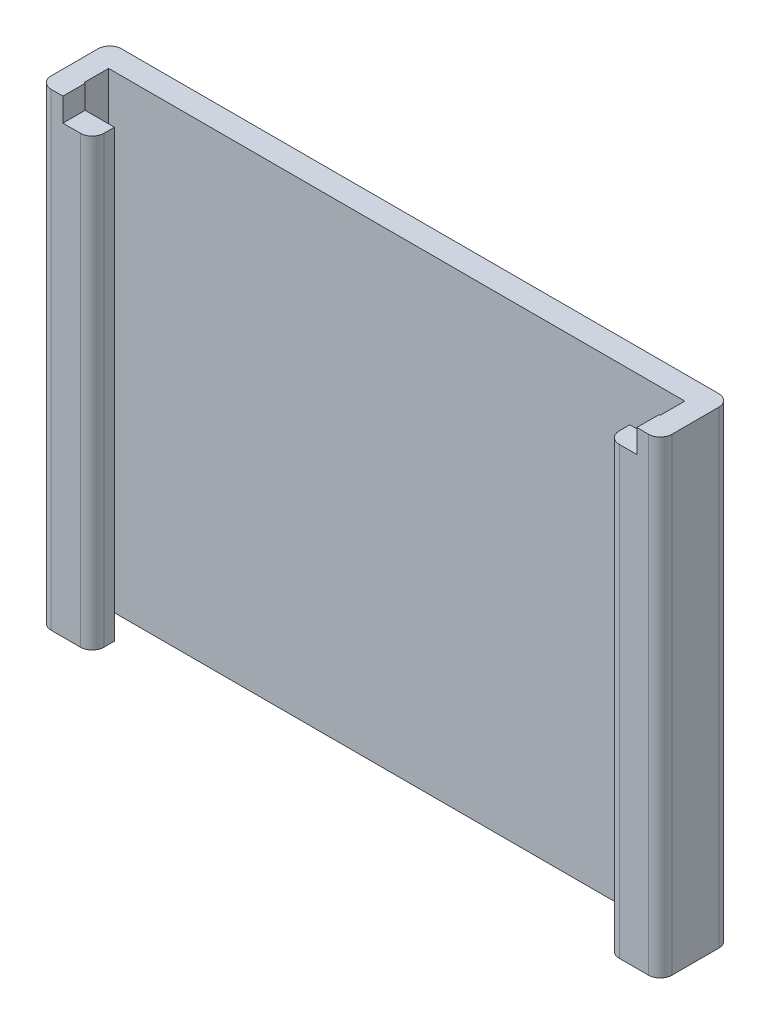
ISO-10303-21;
HEADER;
FILE_DESCRIPTION(('STEP AP214'),'2;1');
FILE_NAME('part.step','',(''),(''),'','','');
FILE_SCHEMA(('AUTOMOTIVE_DESIGN { 1 0 10303 214 1 1 1 1 }'));
ENDSEC;
DATA;
#1=APPLICATION_CONTEXT('core data for automotive mechanical design processes');
#2=APPLICATION_PROTOCOL_DEFINITION('international standard','automotive_design',2000,#1);
#3=PRODUCT_CONTEXT('',#1,'mechanical');
#4=PRODUCT('Part','Part','',(#3));
#5=PRODUCT_RELATED_PRODUCT_CATEGORY('part','',(#4));
#6=PRODUCT_DEFINITION_FORMATION('','',#4);
#7=PRODUCT_DEFINITION_CONTEXT('part definition',#1,'design');
#8=PRODUCT_DEFINITION('design','',#6,#7);
#9=PRODUCT_DEFINITION_SHAPE('','',#8);
#10=(LENGTH_UNIT() NAMED_UNIT(*) SI_UNIT(.MILLI.,.METRE.));
#11=(NAMED_UNIT(*) PLANE_ANGLE_UNIT() SI_UNIT($,.RADIAN.));
#12=(NAMED_UNIT(*) SI_UNIT($,.STERADIAN.) SOLID_ANGLE_UNIT());
#13=UNCERTAINTY_MEASURE_WITH_UNIT(LENGTH_MEASURE(1.E-05),#10,'distance_accuracy_value','');
#14=(GEOMETRIC_REPRESENTATION_CONTEXT(3) GLOBAL_UNCERTAINTY_ASSIGNED_CONTEXT((#13)) GLOBAL_UNIT_ASSIGNED_CONTEXT((#10,
#11,#12)) REPRESENTATION_CONTEXT('',''));
#15=CARTESIAN_POINT('',(0.,0.,0.));
#16=DIRECTION('',(0.,0.,1.));
#17=DIRECTION('',(1.,0.,0.));
#18=AXIS2_PLACEMENT_3D('',#15,#16,#17);
#19=CARTESIAN_POINT('',(-22.,40.,4.));
#20=DIRECTION('',(-1.,0.,0.));
#21=DIRECTION('',(0.,0.,1.));
#22=AXIS2_PLACEMENT_3D('',#19,#20,#21);
#23=PLANE('',#22);
#24=DIRECTION('',(0.,-1.,0.));
#25=VECTOR('',#24,1.);
#26=CARTESIAN_POINT('',(-22.,45.,2.1));
#27=LINE('',#26,#25);
#28=CARTESIAN_POINT('',(-22.,38.,2.1));
#29=VERTEX_POINT('',#28);
#30=CARTESIAN_POINT('',(-22.,0.,2.1));
#31=VERTEX_POINT('',#30);
#32=EDGE_CURVE('E264',#29,#31,#27,.T.);
#33=ORIENTED_EDGE('',*,*,#32,.F.);
#34=DIRECTION('',(0.,0.,-1.));
#35=VECTOR('',#34,1.);
#36=CARTESIAN_POINT('',(-22.,38.,4.));
#37=LINE('',#36,#35);
#38=CARTESIAN_POINT('',(-22.,38.,3.));
#39=VERTEX_POINT('',#38);
#40=EDGE_CURVE('E276',#39,#29,#37,.T.);
#41=ORIENTED_EDGE('',*,*,#40,.F.);
#42=DIRECTION('',(0.,-1.,0.));
#43=VECTOR('',#42,1.);
#44=CARTESIAN_POINT('',(-22.,40.,3.));
#45=LINE('',#44,#43);
#46=CARTESIAN_POINT('',(-22.,0.,3.));
#47=VERTEX_POINT('',#46);
#48=EDGE_CURVE('E393',#39,#47,#45,.T.);
#49=ORIENTED_EDGE('',*,*,#48,.T.);
#50=DIRECTION('',(0.,0.,-1.));
#51=VECTOR('',#50,1.);
#52=CARTESIAN_POINT('',(-22.,0.,4.));
#53=LINE('',#52,#51);
#54=EDGE_CURVE('E207',#47,#31,#53,.T.);
#55=ORIENTED_EDGE('',*,*,#54,.T.);
#56=EDGE_LOOP('',(#33,#41,#49,#55));
#57=FACE_BOUND('',#56,.T.);
#58=ADVANCED_FACE('F45',(#57),#23,.F.);
#59=CARTESIAN_POINT('',(0.,40.,0.));
#60=DIRECTION('',(0.,1.,0.));
#61=DIRECTION('',(0.,0.,1.));
#62=AXIS2_PLACEMENT_3D('',#59,#60,#61);
#63=PLANE('',#62);
#64=DIRECTION('',(1.,0.,0.));
#65=VECTOR('',#64,1.);
#66=CARTESIAN_POINT('',(-24.5,40.,2.1));
#67=LINE('',#66,#65);
#68=CARTESIAN_POINT('',(-24.6,40.,2.1));
#69=VERTEX_POINT('',#68);
#70=CARTESIAN_POINT('',(-24.5,40.,2.1));
#71=VERTEX_POINT('',#70);
#72=EDGE_CURVE('E223',#69,#71,#67,.T.);
#73=ORIENTED_EDGE('',*,*,#72,.F.);
#74=DIRECTION('',(0.,0.,1.));
#75=VECTOR('',#74,1.);
#76=CARTESIAN_POINT('',(-24.6,40.,0.));
#77=LINE('',#76,#75);
#78=CARTESIAN_POINT('',(-24.6,40.,0.));
#79=VERTEX_POINT('',#78);
#80=EDGE_CURVE('E226',#79,#69,#77,.T.);
#81=ORIENTED_EDGE('',*,*,#80,.F.);
#82=DIRECTION('',(-1.,0.,0.));
#83=VECTOR('',#82,1.);
#84=CARTESIAN_POINT('',(24.5,40.,0.));
#85=LINE('',#84,#83);
#86=CARTESIAN_POINT('',(24.6,40.,0.));
#87=VERTEX_POINT('',#86);
#88=EDGE_CURVE('E213',#87,#79,#85,.T.);
#89=ORIENTED_EDGE('',*,*,#88,.F.);
#90=DIRECTION('',(0.,0.,-1.));
#91=VECTOR('',#90,1.);
#92=CARTESIAN_POINT('',(24.6,40.,0.));
#93=LINE('',#92,#91);
#94=CARTESIAN_POINT('',(24.6,40.,2.1));
#95=VERTEX_POINT('',#94);
#96=EDGE_CURVE('E248',#95,#87,#93,.T.);
#97=ORIENTED_EDGE('',*,*,#96,.F.);
#98=DIRECTION('',(1.,0.,0.));
#99=VECTOR('',#98,1.);
#100=CARTESIAN_POINT('',(24.5,40.,2.1));
#101=LINE('',#100,#99);
#102=CARTESIAN_POINT('',(24.5,40.,2.1));
#103=VERTEX_POINT('',#102);
#104=EDGE_CURVE('E230',#103,#95,#101,.T.);
#105=ORIENTED_EDGE('',*,*,#104,.F.);
#106=DIRECTION('',(0.,0.,1.));
#107=VECTOR('',#106,1.);
#108=CARTESIAN_POINT('',(24.5,40.,0.));
#109=LINE('',#108,#107);
#110=CARTESIAN_POINT('',(24.5,40.,4.));
#111=VERTEX_POINT('',#110);
#112=EDGE_CURVE('E324',#103,#111,#109,.T.);
#113=ORIENTED_EDGE('',*,*,#112,.T.);
#114=DIRECTION('',(-1.,0.,0.));
#115=VECTOR('',#114,1.);
#116=CARTESIAN_POINT('',(26.5,40.,3.99999999999997));
#117=LINE('',#116,#115);
#118=CARTESIAN_POINT('',(25.5,40.,3.99999999999997));
#119=VERTEX_POINT('',#118);
#120=EDGE_CURVE('E320',#119,#111,#117,.T.);
#121=ORIENTED_EDGE('',*,*,#120,.F.);
#122=CARTESIAN_POINT('',(25.5,40.,2.99999999999997));
#123=DIRECTION('',(0.,1.,0.));
#124=DIRECTION('',(0.,0.,1.));
#125=AXIS2_PLACEMENT_3D('',#122,#123,#124);
#126=CIRCLE('',#125,1.);
#127=CARTESIAN_POINT('',(26.5,40.,2.99999999999997));
#128=VERTEX_POINT('',#127);
#129=EDGE_CURVE('E387',#119,#128,#126,.T.);
#130=ORIENTED_EDGE('',*,*,#129,.T.);
#131=DIRECTION('',(0.,0.,1.));
#132=VECTOR('',#131,1.);
#133=CARTESIAN_POINT('',(26.5,40.,-2.00000000000003));
#134=LINE('',#133,#132);
#135=CARTESIAN_POINT('',(26.5,40.,-1.00000000000003));
#136=VERTEX_POINT('',#135);
#137=EDGE_CURVE('E316',#136,#128,#134,.T.);
#138=ORIENTED_EDGE('',*,*,#137,.F.);
#139=CARTESIAN_POINT('',(25.5,40.,-1.00000000000003));
#140=DIRECTION('',(0.,1.,0.));
#141=DIRECTION('',(0.,0.,1.));
#142=AXIS2_PLACEMENT_3D('',#139,#140,#141);
#143=CIRCLE('',#142,1.);
#144=CARTESIAN_POINT('',(25.5,40.,-2.00000000000003));
#145=VERTEX_POINT('',#144);
#146=EDGE_CURVE('E390',#136,#145,#143,.T.);
#147=ORIENTED_EDGE('',*,*,#146,.T.);
#148=DIRECTION('',(-1.,0.,0.));
#149=VECTOR('',#148,1.);
#150=CARTESIAN_POINT('',(26.5,40.,-2.00000000000003));
#151=LINE('',#150,#149);
#152=CARTESIAN_POINT('',(-25.5,40.,-2.));
#153=VERTEX_POINT('',#152);
#154=EDGE_CURVE('E312',#145,#153,#151,.T.);
#155=ORIENTED_EDGE('',*,*,#154,.T.);
#156=CARTESIAN_POINT('',(-25.5,40.,-0.999999999999997));
#157=DIRECTION('',(0.,1.,0.));
#158=DIRECTION('',(0.,0.,1.));
#159=AXIS2_PLACEMENT_3D('',#156,#157,#158);
#160=CIRCLE('',#159,1.);
#161=CARTESIAN_POINT('',(-26.5,40.,-0.999999999999997));
#162=VERTEX_POINT('',#161);
#163=EDGE_CURVE('E384',#153,#162,#160,.T.);
#164=ORIENTED_EDGE('',*,*,#163,.T.);
#165=DIRECTION('',(0.,0.,1.));
#166=VECTOR('',#165,1.);
#167=CARTESIAN_POINT('',(-26.5,40.,-2.));
#168=LINE('',#167,#166);
#169=CARTESIAN_POINT('',(-26.5,40.,3.));
#170=VERTEX_POINT('',#169);
#171=EDGE_CURVE('E308',#162,#170,#168,.T.);
#172=ORIENTED_EDGE('',*,*,#171,.T.);
#173=CARTESIAN_POINT('',(-25.5,40.,3.));
#174=DIRECTION('',(0.,1.,0.));
#175=DIRECTION('',(0.,0.,1.));
#176=AXIS2_PLACEMENT_3D('',#173,#174,#175);
#177=CIRCLE('',#176,1.);
#178=CARTESIAN_POINT('',(-25.5,40.,4.));
#179=VERTEX_POINT('',#178);
#180=EDGE_CURVE('E381',#170,#179,#177,.T.);
#181=ORIENTED_EDGE('',*,*,#180,.T.);
#182=DIRECTION('',(1.,0.,0.));
#183=VECTOR('',#182,1.);
#184=CARTESIAN_POINT('',(-26.5,40.,4.));
#185=LINE('',#184,#183);
#186=CARTESIAN_POINT('',(-24.5,40.,4.));
#187=VERTEX_POINT('',#186);
#188=EDGE_CURVE('E304',#179,#187,#185,.T.);
#189=ORIENTED_EDGE('',*,*,#188,.T.);
#190=DIRECTION('',(0.,0.,1.));
#191=VECTOR('',#190,1.);
#192=CARTESIAN_POINT('',(-24.5,40.,0.));
#193=LINE('',#192,#191);
#194=EDGE_CURVE('E300',#71,#187,#193,.T.);
#195=ORIENTED_EDGE('',*,*,#194,.F.);
#196=EDGE_LOOP('',(#73,#81,#89,#97,#105,#113,#121,#130,#138,#147,#155,#164,#172,#181,#189,#195));
#197=FACE_BOUND('',#196,.T.);
#198=ADVANCED_FACE('F451',(#197),#63,.T.);
#199=CARTESIAN_POINT('',(0.,0.,0.));
#200=DIRECTION('',(0.,1.,0.));
#201=DIRECTION('',(0.,0.,1.));
#202=AXIS2_PLACEMENT_3D('',#199,#200,#201);
#203=PLANE('',#202);
#204=DIRECTION('',(0.,0.,1.));
#205=VECTOR('',#204,1.);
#206=CARTESIAN_POINT('',(-24.6,0.,0.));
#207=LINE('',#206,#205);
#208=CARTESIAN_POINT('',(-24.6,0.,0.));
#209=VERTEX_POINT('',#208);
#210=CARTESIAN_POINT('',(-24.6,0.,2.1));
#211=VERTEX_POINT('',#210);
#212=EDGE_CURVE('E200',#209,#211,#207,.T.);
#213=ORIENTED_EDGE('',*,*,#212,.T.);
#214=DIRECTION('',(1.,0.,0.));
#215=VECTOR('',#214,1.);
#216=CARTESIAN_POINT('',(-24.5,0.,2.1));
#217=LINE('',#216,#215);
#218=EDGE_CURVE('E261',#211,#31,#217,.T.);
#219=ORIENTED_EDGE('',*,*,#218,.T.);
#220=ORIENTED_EDGE('',*,*,#54,.F.);
#221=CARTESIAN_POINT('',(-23.,0.,3.));
#222=DIRECTION('',(0.,1.,0.));
#223=DIRECTION('',(0.,0.,1.));
#224=AXIS2_PLACEMENT_3D('',#221,#222,#223);
#225=CIRCLE('',#224,1.);
#226=CARTESIAN_POINT('',(-23.,0.,4.));
#227=VERTEX_POINT('',#226);
#228=EDGE_CURVE('E371',#47,#227,#225,.F.);
#229=ORIENTED_EDGE('',*,*,#228,.T.);
#230=DIRECTION('',(1.,0.,0.));
#231=VECTOR('',#230,1.);
#232=CARTESIAN_POINT('',(-26.5,0.,4.));
#233=LINE('',#232,#231);
#234=CARTESIAN_POINT('',(-25.5,0.,4.));
#235=VERTEX_POINT('',#234);
#236=EDGE_CURVE('E331',#235,#227,#233,.T.);
#237=ORIENTED_EDGE('',*,*,#236,.F.);
#238=CARTESIAN_POINT('',(-25.5,0.,3.));
#239=DIRECTION('',(0.,1.,0.));
#240=DIRECTION('',(0.,0.,1.));
#241=AXIS2_PLACEMENT_3D('',#238,#239,#240);
#242=CIRCLE('',#241,1.);
#243=CARTESIAN_POINT('',(-26.5,0.,3.));
#244=VERTEX_POINT('',#243);
#245=EDGE_CURVE('E359',#235,#244,#242,.F.);
#246=ORIENTED_EDGE('',*,*,#245,.T.);
#247=DIRECTION('',(0.,0.,1.));
#248=VECTOR('',#247,1.);
#249=CARTESIAN_POINT('',(-26.5,0.,-2.));
#250=LINE('',#249,#248);
#251=CARTESIAN_POINT('',(-26.5,0.,-0.999999999999997));
#252=VERTEX_POINT('',#251);
#253=EDGE_CURVE('E335',#252,#244,#250,.T.);
#254=ORIENTED_EDGE('',*,*,#253,.F.);
#255=CARTESIAN_POINT('',(-25.5,0.,-0.999999999999997));
#256=DIRECTION('',(0.,1.,0.));
#257=DIRECTION('',(0.,0.,1.));
#258=AXIS2_PLACEMENT_3D('',#255,#256,#257);
#259=CIRCLE('',#258,1.);
#260=CARTESIAN_POINT('',(-25.5,0.,-2.));
#261=VERTEX_POINT('',#260);
#262=EDGE_CURVE('E362',#252,#261,#259,.F.);
#263=ORIENTED_EDGE('',*,*,#262,.T.);
#264=DIRECTION('',(-1.,0.,0.));
#265=VECTOR('',#264,1.);
#266=CARTESIAN_POINT('',(26.5,0.,-2.00000000000003));
#267=LINE('',#266,#265);
#268=CARTESIAN_POINT('',(25.5,0.,-2.00000000000003));
#269=VERTEX_POINT('',#268);
#270=EDGE_CURVE('E339',#269,#261,#267,.T.);
#271=ORIENTED_EDGE('',*,*,#270,.F.);
#272=CARTESIAN_POINT('',(25.5,0.,-1.00000000000003));
#273=DIRECTION('',(0.,1.,0.));
#274=DIRECTION('',(0.,0.,1.));
#275=AXIS2_PLACEMENT_3D('',#272,#273,#274);
#276=CIRCLE('',#275,1.);
#277=CARTESIAN_POINT('',(26.5,0.,-1.00000000000003));
#278=VERTEX_POINT('',#277);
#279=EDGE_CURVE('E368',#269,#278,#276,.F.);
#280=ORIENTED_EDGE('',*,*,#279,.T.);
#281=DIRECTION('',(0.,0.,1.));
#282=VECTOR('',#281,1.);
#283=CARTESIAN_POINT('',(26.5,0.,-2.00000000000003));
#284=LINE('',#283,#282);
#285=CARTESIAN_POINT('',(26.5,0.,2.99999999999997));
#286=VERTEX_POINT('',#285);
#287=EDGE_CURVE('E343',#278,#286,#284,.T.);
#288=ORIENTED_EDGE('',*,*,#287,.T.);
#289=CARTESIAN_POINT('',(25.5,0.,2.99999999999997));
#290=DIRECTION('',(0.,1.,0.));
#291=DIRECTION('',(0.,0.,1.));
#292=AXIS2_PLACEMENT_3D('',#289,#290,#291);
#293=CIRCLE('',#292,1.);
#294=CARTESIAN_POINT('',(25.5,0.,3.99999999999997));
#295=VERTEX_POINT('',#294);
#296=EDGE_CURVE('E365',#286,#295,#293,.F.);
#297=ORIENTED_EDGE('',*,*,#296,.T.);
#298=DIRECTION('',(-1.,0.,0.));
#299=VECTOR('',#298,1.);
#300=CARTESIAN_POINT('',(26.5,0.,3.99999999999997));
#301=LINE('',#300,#299);
#302=CARTESIAN_POINT('',(23.,0.,3.99999999999998));
#303=VERTEX_POINT('',#302);
#304=EDGE_CURVE('E347',#295,#303,#301,.T.);
#305=ORIENTED_EDGE('',*,*,#304,.T.);
#306=CARTESIAN_POINT('',(23.,0.,2.99999999999997));
#307=DIRECTION('',(0.,1.,0.));
#308=DIRECTION('',(0.,0.,1.));
#309=AXIS2_PLACEMENT_3D('',#306,#307,#308);
#310=CIRCLE('',#309,1.);
#311=CARTESIAN_POINT('',(22.,0.,2.99999999999997));
#312=VERTEX_POINT('',#311);
#313=EDGE_CURVE('E374',#303,#312,#310,.F.);
#314=ORIENTED_EDGE('',*,*,#313,.T.);
#315=DIRECTION('',(0.,0.,-1.));
#316=VECTOR('',#315,1.);
#317=CARTESIAN_POINT('',(22.,0.,3.99999999999998));
#318=LINE('',#317,#316);
#319=CARTESIAN_POINT('',(22.,0.,2.1));
#320=VERTEX_POINT('',#319);
#321=EDGE_CURVE('E301',#312,#320,#318,.T.);
#322=ORIENTED_EDGE('',*,*,#321,.T.);
#323=DIRECTION('',(-1.,0.,0.));
#324=VECTOR('',#323,1.);
#325=CARTESIAN_POINT('',(24.5,0.,2.1));
#326=LINE('',#325,#324);
#327=CARTESIAN_POINT('',(24.6,0.,2.1));
#328=VERTEX_POINT('',#327);
#329=EDGE_CURVE('E236',#328,#320,#326,.T.);
#330=ORIENTED_EDGE('',*,*,#329,.F.);
#331=DIRECTION('',(0.,0.,-1.));
#332=VECTOR('',#331,1.);
#333=CARTESIAN_POINT('',(24.6,0.,0.));
#334=LINE('',#333,#332);
#335=CARTESIAN_POINT('',(24.6,0.,0.));
#336=VERTEX_POINT('',#335);
#337=EDGE_CURVE('E202',#328,#336,#334,.T.);
#338=ORIENTED_EDGE('',*,*,#337,.T.);
#339=DIRECTION('',(-1.,0.,0.));
#340=VECTOR('',#339,1.);
#341=CARTESIAN_POINT('',(24.5,0.,0.));
#342=LINE('',#341,#340);
#343=EDGE_CURVE('E195',#336,#209,#342,.T.);
#344=ORIENTED_EDGE('',*,*,#343,.T.);
#345=EDGE_LOOP('',(#213,#219,#220,#229,#237,#246,#254,#263,#271,#280,#288,#297,#305,#314,#322,
#330,#338,#344));
#346=FACE_BOUND('',#345,.T.);
#347=ADVANCED_FACE('F197',(#346),#203,.F.);
#348=CARTESIAN_POINT('',(-23.,40.,3.));
#349=DIRECTION('',(0.,-1.,0.));
#350=DIRECTION('',(0.,0.,-1.));
#351=AXIS2_PLACEMENT_3D('',#348,#349,#350);
#352=CYLINDRICAL_SURFACE('',#351,1.);
#353=ORIENTED_EDGE('',*,*,#48,.F.);
#354=CARTESIAN_POINT('',(-23.,38.,3.));
#355=DIRECTION('',(0.,1.,0.));
#356=DIRECTION('',(0.,0.,1.));
#357=AXIS2_PLACEMENT_3D('',#354,#355,#356);
#358=CIRCLE('',#357,1.);
#359=CARTESIAN_POINT('',(-23.,38.,4.));
#360=VERTEX_POINT('',#359);
#361=EDGE_CURVE('E425',#39,#360,#358,.F.);
#362=ORIENTED_EDGE('',*,*,#361,.T.);
#363=DIRECTION('',(0.,-1.,0.));
#364=VECTOR('',#363,1.);
#365=CARTESIAN_POINT('',(-23.,40.,4.));
#366=LINE('',#365,#364);
#367=EDGE_CURVE('E400',#227,#360,#366,.F.);
#368=ORIENTED_EDGE('',*,*,#367,.F.);
#369=ORIENTED_EDGE('',*,*,#228,.F.);
#370=EDGE_LOOP('',(#353,#362,#368,#369));
#371=FACE_BOUND('',#370,.T.);
#372=ADVANCED_FACE('F529',(#371),#352,.T.);
#373=CARTESIAN_POINT('',(24.5,40.,0.));
#374=DIRECTION('',(0.,0.,1.));
#375=DIRECTION('',(1.,0.,0.));
#376=AXIS2_PLACEMENT_3D('',#373,#374,#375);
#377=PLANE('',#376);
#378=ORIENTED_EDGE('',*,*,#88,.T.);
#379=DIRECTION('',(0.,1.,0.));
#380=VECTOR('',#379,1.);
#381=CARTESIAN_POINT('',(-24.6,0.,0.));
#382=LINE('',#381,#380);
#383=EDGE_CURVE('E211',#209,#79,#382,.T.);
#384=ORIENTED_EDGE('',*,*,#383,.F.);
#385=ORIENTED_EDGE('',*,*,#343,.F.);
#386=DIRECTION('',(0.,1.,0.));
#387=VECTOR('',#386,1.);
#388=CARTESIAN_POINT('',(24.6,0.,0.));
#389=LINE('',#388,#387);
#390=EDGE_CURVE('E245',#336,#87,#389,.T.);
#391=ORIENTED_EDGE('',*,*,#390,.T.);
#392=EDGE_LOOP('',(#378,#384,#385,#391));
#393=FACE_BOUND('',#392,.T.);
#394=ADVANCED_FACE('F212',(#393),#377,.T.);
#395=CARTESIAN_POINT('',(24.5,40.,0.));
#396=DIRECTION('',(1.,0.,0.));
#397=DIRECTION('',(0.,0.,-1.));
#398=AXIS2_PLACEMENT_3D('',#395,#396,#397);
#399=PLANE('',#398);
#400=ORIENTED_EDGE('',*,*,#112,.F.);
#401=DIRECTION('',(0.,1.,0.));
#402=VECTOR('',#401,1.);
#403=CARTESIAN_POINT('',(24.5,0.,2.1));
#404=LINE('',#403,#402);
#405=CARTESIAN_POINT('',(24.5,38.,2.1));
#406=VERTEX_POINT('',#405);
#407=EDGE_CURVE('E239',#406,#103,#404,.T.);
#408=ORIENTED_EDGE('',*,*,#407,.F.);
#409=DIRECTION('',(0.,0.,-1.));
#410=VECTOR('',#409,1.);
#411=CARTESIAN_POINT('',(24.5,38.,2.));
#412=LINE('',#411,#410);
#413=CARTESIAN_POINT('',(24.5,38.,3.99999999999997));
#414=VERTEX_POINT('',#413);
#415=EDGE_CURVE('E267',#414,#406,#412,.T.);
#416=ORIENTED_EDGE('',*,*,#415,.F.);
#417=DIRECTION('',(0.,1.,0.));
#418=VECTOR('',#417,1.);
#419=CARTESIAN_POINT('',(24.5,40.,3.99999999999997));
#420=LINE('',#419,#418);
#421=EDGE_CURVE('E291',#414,#111,#420,.T.);
#422=ORIENTED_EDGE('',*,*,#421,.T.);
#423=EDGE_LOOP('',(#400,#408,#416,#422));
#424=FACE_BOUND('',#423,.T.);
#425=ADVANCED_FACE('F504',(#424),#399,.F.);
#426=CARTESIAN_POINT('',(22.,40.,3.99999999999998));
#427=DIRECTION('',(-1.,0.,0.));
#428=DIRECTION('',(0.,0.,1.));
#429=AXIS2_PLACEMENT_3D('',#426,#427,#428);
#430=PLANE('',#429);
#431=DIRECTION('',(0.,-1.,0.));
#432=VECTOR('',#431,1.);
#433=CARTESIAN_POINT('',(22.,45.,2.1));
#434=LINE('',#433,#432);
#435=CARTESIAN_POINT('',(22.,38.,2.1));
#436=VERTEX_POINT('',#435);
#437=EDGE_CURVE('E61',#436,#320,#434,.T.);
#438=ORIENTED_EDGE('',*,*,#437,.T.);
#439=ORIENTED_EDGE('',*,*,#321,.F.);
#440=DIRECTION('',(0.,-1.,0.));
#441=VECTOR('',#440,1.);
#442=CARTESIAN_POINT('',(22.,40.,2.99999999999997));
#443=LINE('',#442,#441);
#444=CARTESIAN_POINT('',(22.,38.,2.99999999999997));
#445=VERTEX_POINT('',#444);
#446=EDGE_CURVE('E377',#312,#445,#443,.F.);
#447=ORIENTED_EDGE('',*,*,#446,.T.);
#448=DIRECTION('',(0.,0.,1.));
#449=VECTOR('',#448,1.);
#450=CARTESIAN_POINT('',(22.,38.,3.99999999999998));
#451=LINE('',#450,#449);
#452=EDGE_CURVE('E67',#436,#445,#451,.T.);
#453=ORIENTED_EDGE('',*,*,#452,.F.);
#454=EDGE_LOOP('',(#438,#439,#447,#453));
#455=FACE_BOUND('',#454,.T.);
#456=ADVANCED_FACE('F506',(#455),#430,.T.);
#457=CARTESIAN_POINT('',(26.5,40.,3.99999999999997));
#458=DIRECTION('',(0.,0.,1.));
#459=DIRECTION('',(1.,0.,0.));
#460=AXIS2_PLACEMENT_3D('',#457,#458,#459);
#461=PLANE('',#460);
#462=ORIENTED_EDGE('',*,*,#421,.F.);
#463=DIRECTION('',(1.,0.,0.));
#464=VECTOR('',#463,1.);
#465=CARTESIAN_POINT('',(26.5,38.,3.99999999999997));
#466=LINE('',#465,#464);
#467=CARTESIAN_POINT('',(23.,38.,3.99999999999997));
#468=VERTEX_POINT('',#467);
#469=EDGE_CURVE('E286',#468,#414,#466,.T.);
#470=ORIENTED_EDGE('',*,*,#469,.F.);
#471=DIRECTION('',(0.,-1.,0.));
#472=VECTOR('',#471,1.);
#473=CARTESIAN_POINT('',(23.,40.,3.99999999999998));
#474=LINE('',#473,#472);
#475=EDGE_CURVE('E356',#468,#303,#474,.T.);
#476=ORIENTED_EDGE('',*,*,#475,.T.);
#477=ORIENTED_EDGE('',*,*,#304,.F.);
#478=DIRECTION('',(0.,-1.,0.));
#479=VECTOR('',#478,1.);
#480=CARTESIAN_POINT('',(25.5,40.,3.99999999999997));
#481=LINE('',#480,#479);
#482=EDGE_CURVE('E326',#295,#119,#481,.F.);
#483=ORIENTED_EDGE('',*,*,#482,.T.);
#484=ORIENTED_EDGE('',*,*,#120,.T.);
#485=EDGE_LOOP('',(#462,#470,#476,#477,#483,#484));
#486=FACE_BOUND('',#485,.T.);
#487=ADVANCED_FACE('F437',(#486),#461,.T.);
#488=CARTESIAN_POINT('',(26.5,40.,-2.00000000000003));
#489=DIRECTION('',(1.,0.,0.));
#490=DIRECTION('',(0.,0.,-1.));
#491=AXIS2_PLACEMENT_3D('',#488,#489,#490);
#492=PLANE('',#491);
#493=ORIENTED_EDGE('',*,*,#287,.F.);
#494=DIRECTION('',(0.,-1.,0.));
#495=VECTOR('',#494,1.);
#496=CARTESIAN_POINT('',(26.5,40.,-1.00000000000003));
#497=LINE('',#496,#495);
#498=EDGE_CURVE('E415',#278,#136,#497,.F.);
#499=ORIENTED_EDGE('',*,*,#498,.T.);
#500=ORIENTED_EDGE('',*,*,#137,.T.);
#501=DIRECTION('',(0.,-1.,0.));
#502=VECTOR('',#501,1.);
#503=CARTESIAN_POINT('',(26.5,40.,2.99999999999997));
#504=LINE('',#503,#502);
#505=EDGE_CURVE('E411',#128,#286,#504,.T.);
#506=ORIENTED_EDGE('',*,*,#505,.T.);
#507=EDGE_LOOP('',(#493,#499,#500,#506));
#508=FACE_BOUND('',#507,.T.);
#509=ADVANCED_FACE('F455',(#508),#492,.T.);
#510=CARTESIAN_POINT('',(26.5,40.,-2.00000000000003));
#511=DIRECTION('',(0.,0.,1.));
#512=DIRECTION('',(1.,0.,0.));
#513=AXIS2_PLACEMENT_3D('',#510,#511,#512);
#514=PLANE('',#513);
#515=ORIENTED_EDGE('',*,*,#154,.F.);
#516=DIRECTION('',(0.,-1.,0.));
#517=VECTOR('',#516,1.);
#518=CARTESIAN_POINT('',(25.5,0.,-2.00000000000003));
#519=LINE('',#518,#517);
#520=EDGE_CURVE('E407',#145,#269,#519,.T.);
#521=ORIENTED_EDGE('',*,*,#520,.T.);
#522=ORIENTED_EDGE('',*,*,#270,.T.);
#523=DIRECTION('',(0.,-1.,0.));
#524=VECTOR('',#523,1.);
#525=CARTESIAN_POINT('',(-25.5,40.,-2.));
#526=LINE('',#525,#524);
#527=EDGE_CURVE('E404',#261,#153,#526,.F.);
#528=ORIENTED_EDGE('',*,*,#527,.T.);
#529=EDGE_LOOP('',(#515,#521,#522,#528));
#530=FACE_BOUND('',#529,.T.);
#531=ADVANCED_FACE('F463',(#530),#514,.F.);
#532=CARTESIAN_POINT('',(-26.5,40.,-2.));
#533=DIRECTION('',(1.,0.,0.));
#534=DIRECTION('',(0.,0.,-1.));
#535=AXIS2_PLACEMENT_3D('',#532,#533,#534);
#536=PLANE('',#535);
#537=ORIENTED_EDGE('',*,*,#171,.F.);
#538=DIRECTION('',(0.,-1.,0.));
#539=VECTOR('',#538,1.);
#540=CARTESIAN_POINT('',(-26.5,40.,-0.999999999999997));
#541=LINE('',#540,#539);
#542=EDGE_CURVE('E421',#162,#252,#541,.T.);
#543=ORIENTED_EDGE('',*,*,#542,.T.);
#544=ORIENTED_EDGE('',*,*,#253,.T.);
#545=DIRECTION('',(0.,-1.,0.));
#546=VECTOR('',#545,1.);
#547=CARTESIAN_POINT('',(-26.5,40.,3.));
#548=LINE('',#547,#546);
#549=EDGE_CURVE('E418',#244,#170,#548,.F.);
#550=ORIENTED_EDGE('',*,*,#549,.T.);
#551=EDGE_LOOP('',(#537,#543,#544,#550));
#552=FACE_BOUND('',#551,.T.);
#553=ADVANCED_FACE('F472',(#552),#536,.F.);
#554=CARTESIAN_POINT('',(-26.5,40.,4.));
#555=DIRECTION('',(0.,0.,-1.));
#556=DIRECTION('',(-1.,0.,0.));
#557=AXIS2_PLACEMENT_3D('',#554,#555,#556);
#558=PLANE('',#557);
#559=DIRECTION('',(1.,0.,0.));
#560=VECTOR('',#559,1.);
#561=CARTESIAN_POINT('',(-26.5,38.,4.));
#562=LINE('',#561,#560);
#563=CARTESIAN_POINT('',(-24.5,38.,4.));
#564=VERTEX_POINT('',#563);
#565=EDGE_CURVE('E283',#564,#360,#562,.T.);
#566=ORIENTED_EDGE('',*,*,#565,.F.);
#567=DIRECTION('',(0.,1.,0.));
#568=VECTOR('',#567,1.);
#569=CARTESIAN_POINT('',(-24.5,40.,4.));
#570=LINE('',#569,#568);
#571=EDGE_CURVE('E208',#564,#187,#570,.T.);
#572=ORIENTED_EDGE('',*,*,#571,.T.);
#573=ORIENTED_EDGE('',*,*,#188,.F.);
#574=DIRECTION('',(0.,-1.,0.));
#575=VECTOR('',#574,1.);
#576=CARTESIAN_POINT('',(-25.5,40.,4.));
#577=LINE('',#576,#575);
#578=EDGE_CURVE('E396',#179,#235,#577,.T.);
#579=ORIENTED_EDGE('',*,*,#578,.T.);
#580=ORIENTED_EDGE('',*,*,#236,.T.);
#581=ORIENTED_EDGE('',*,*,#367,.T.);
#582=EDGE_LOOP('',(#566,#572,#573,#579,#580,#581));
#583=FACE_BOUND('',#582,.T.);
#584=ADVANCED_FACE('F481',(#583),#558,.F.);
#585=CARTESIAN_POINT('',(-24.5,40.,0.));
#586=DIRECTION('',(1.,0.,0.));
#587=DIRECTION('',(0.,0.,-1.));
#588=AXIS2_PLACEMENT_3D('',#585,#586,#587);
#589=PLANE('',#588);
#590=DIRECTION('',(0.,1.,0.));
#591=VECTOR('',#590,1.);
#592=CARTESIAN_POINT('',(-24.5,0.,2.1));
#593=LINE('',#592,#591);
#594=CARTESIAN_POINT('',(-24.5,38.,2.1));
#595=VERTEX_POINT('',#594);
#596=EDGE_CURVE('E232',#595,#71,#593,.T.);
#597=ORIENTED_EDGE('',*,*,#596,.T.);
#598=ORIENTED_EDGE('',*,*,#194,.T.);
#599=ORIENTED_EDGE('',*,*,#571,.F.);
#600=DIRECTION('',(0.,0.,1.));
#601=VECTOR('',#600,1.);
#602=CARTESIAN_POINT('',(-24.5,38.,4.82490347023973));
#603=LINE('',#602,#601);
#604=EDGE_CURVE('E272',#595,#564,#603,.T.);
#605=ORIENTED_EDGE('',*,*,#604,.F.);
#606=EDGE_LOOP('',(#597,#598,#599,#605));
#607=FACE_BOUND('',#606,.T.);
#608=ADVANCED_FACE('F485',(#607),#589,.T.);
#609=CARTESIAN_POINT('',(23.,40.,2.99999999999997));
#610=DIRECTION('',(0.,-1.,0.));
#611=DIRECTION('',(0.,0.,-1.));
#612=AXIS2_PLACEMENT_3D('',#609,#610,#611);
#613=CYLINDRICAL_SURFACE('',#612,1.);
#614=CARTESIAN_POINT('',(23.,38.,2.99999999999997));
#615=DIRECTION('',(0.,-1.,0.));
#616=DIRECTION('',(0.,0.,-1.));
#617=AXIS2_PLACEMENT_3D('',#614,#615,#616);
#618=CIRCLE('',#617,1.);
#619=EDGE_CURVE('E54',#445,#468,#618,.F.);
#620=ORIENTED_EDGE('',*,*,#619,.F.);
#621=ORIENTED_EDGE('',*,*,#446,.F.);
#622=ORIENTED_EDGE('',*,*,#313,.F.);
#623=ORIENTED_EDGE('',*,*,#475,.F.);
#624=EDGE_LOOP('',(#620,#621,#622,#623));
#625=FACE_BOUND('',#624,.T.);
#626=ADVANCED_FACE('F440',(#625),#613,.T.);
#627=CARTESIAN_POINT('',(25.5,40.,-1.00000000000003));
#628=DIRECTION('',(0.,1.,0.));
#629=DIRECTION('',(0.,0.,1.));
#630=AXIS2_PLACEMENT_3D('',#627,#628,#629);
#631=CYLINDRICAL_SURFACE('',#630,1.);
#632=ORIENTED_EDGE('',*,*,#146,.F.);
#633=ORIENTED_EDGE('',*,*,#498,.F.);
#634=ORIENTED_EDGE('',*,*,#279,.F.);
#635=ORIENTED_EDGE('',*,*,#520,.F.);
#636=EDGE_LOOP('',(#632,#633,#634,#635));
#637=FACE_BOUND('',#636,.T.);
#638=ADVANCED_FACE('F458',(#637),#631,.T.);
#639=CARTESIAN_POINT('',(25.5,40.,2.99999999999997));
#640=DIRECTION('',(0.,-1.,0.));
#641=DIRECTION('',(0.,0.,-1.));
#642=AXIS2_PLACEMENT_3D('',#639,#640,#641);
#643=CYLINDRICAL_SURFACE('',#642,1.);
#644=ORIENTED_EDGE('',*,*,#129,.F.);
#645=ORIENTED_EDGE('',*,*,#482,.F.);
#646=ORIENTED_EDGE('',*,*,#296,.F.);
#647=ORIENTED_EDGE('',*,*,#505,.F.);
#648=EDGE_LOOP('',(#644,#645,#646,#647));
#649=FACE_BOUND('',#648,.T.);
#650=ADVANCED_FACE('F446',(#649),#643,.T.);
#651=CARTESIAN_POINT('',(-25.5,40.,-0.999999999999997));
#652=DIRECTION('',(0.,-1.,0.));
#653=DIRECTION('',(0.,0.,-1.));
#654=AXIS2_PLACEMENT_3D('',#651,#652,#653);
#655=CYLINDRICAL_SURFACE('',#654,1.);
#656=ORIENTED_EDGE('',*,*,#163,.F.);
#657=ORIENTED_EDGE('',*,*,#527,.F.);
#658=ORIENTED_EDGE('',*,*,#262,.F.);
#659=ORIENTED_EDGE('',*,*,#542,.F.);
#660=EDGE_LOOP('',(#656,#657,#658,#659));
#661=FACE_BOUND('',#660,.T.);
#662=ADVANCED_FACE('F467',(#661),#655,.T.);
#663=CARTESIAN_POINT('',(-25.5,40.,3.));
#664=DIRECTION('',(0.,-1.,0.));
#665=DIRECTION('',(0.,0.,-1.));
#666=AXIS2_PLACEMENT_3D('',#663,#664,#665);
#667=CYLINDRICAL_SURFACE('',#666,1.);
#668=ORIENTED_EDGE('',*,*,#180,.F.);
#669=ORIENTED_EDGE('',*,*,#549,.F.);
#670=ORIENTED_EDGE('',*,*,#245,.F.);
#671=ORIENTED_EDGE('',*,*,#578,.F.);
#672=EDGE_LOOP('',(#668,#669,#670,#671));
#673=FACE_BOUND('',#672,.T.);
#674=ADVANCED_FACE('F47',(#673),#667,.T.);
#675=CARTESIAN_POINT('',(0.,38.,0.));
#676=DIRECTION('',(0.,1.,0.));
#677=DIRECTION('',(0.,0.,1.));
#678=AXIS2_PLACEMENT_3D('',#675,#676,#677);
#679=PLANE('',#678);
#680=ORIENTED_EDGE('',*,*,#565,.T.);
#681=ORIENTED_EDGE('',*,*,#361,.F.);
#682=ORIENTED_EDGE('',*,*,#40,.T.);
#683=DIRECTION('',(-1.,0.,0.));
#684=VECTOR('',#683,1.);
#685=CARTESIAN_POINT('',(-24.5,38.,2.1));
#686=LINE('',#685,#684);
#687=EDGE_CURVE('E268',#29,#595,#686,.T.);
#688=ORIENTED_EDGE('',*,*,#687,.T.);
#689=ORIENTED_EDGE('',*,*,#604,.T.);
#690=EDGE_LOOP('',(#680,#681,#682,#688,#689));
#691=FACE_BOUND('',#690,.T.);
#692=ADVANCED_FACE('F487',(#691),#679,.T.);
#693=CARTESIAN_POINT('',(0.,38.,0.));
#694=DIRECTION('',(0.,-1.,0.));
#695=DIRECTION('',(0.,0.,-1.));
#696=AXIS2_PLACEMENT_3D('',#693,#694,#695);
#697=PLANE('',#696);
#698=ORIENTED_EDGE('',*,*,#415,.T.);
#699=DIRECTION('',(-1.,0.,0.));
#700=VECTOR('',#699,1.);
#701=CARTESIAN_POINT('',(0.,38.,2.1));
#702=LINE('',#701,#700);
#703=EDGE_CURVE('E11',#406,#436,#702,.T.);
#704=ORIENTED_EDGE('',*,*,#703,.T.);
#705=ORIENTED_EDGE('',*,*,#452,.T.);
#706=ORIENTED_EDGE('',*,*,#619,.T.);
#707=ORIENTED_EDGE('',*,*,#469,.T.);
#708=EDGE_LOOP('',(#698,#704,#705,#706,#707));
#709=FACE_BOUND('',#708,.T.);
#710=ADVANCED_FACE('F430',(#709),#697,.F.);
#711=CARTESIAN_POINT('',(-24.5,45.,2.1));
#712=DIRECTION('',(0.,0.,-1.));
#713=DIRECTION('',(-1.,0.,0.));
#714=AXIS2_PLACEMENT_3D('',#711,#712,#713);
#715=PLANE('',#714);
#716=ORIENTED_EDGE('',*,*,#32,.T.);
#717=ORIENTED_EDGE('',*,*,#218,.F.);
#718=DIRECTION('',(0.,1.,0.));
#719=VECTOR('',#718,1.);
#720=CARTESIAN_POINT('',(-24.6,0.,2.1));
#721=LINE('',#720,#719);
#722=EDGE_CURVE('E218',#211,#69,#721,.T.);
#723=ORIENTED_EDGE('',*,*,#722,.T.);
#724=ORIENTED_EDGE('',*,*,#72,.T.);
#725=ORIENTED_EDGE('',*,*,#596,.F.);
#726=ORIENTED_EDGE('',*,*,#687,.F.);
#727=EDGE_LOOP('',(#716,#717,#723,#724,#725,#726));
#728=FACE_BOUND('',#727,.T.);
#729=ADVANCED_FACE('F491',(#728),#715,.T.);
#730=CARTESIAN_POINT('',(24.5,45.,2.1));
#731=DIRECTION('',(0.,0.,1.));
#732=DIRECTION('',(1.,0.,0.));
#733=AXIS2_PLACEMENT_3D('',#730,#731,#732);
#734=PLANE('',#733);
#735=ORIENTED_EDGE('',*,*,#703,.F.);
#736=ORIENTED_EDGE('',*,*,#407,.T.);
#737=ORIENTED_EDGE('',*,*,#104,.T.);
#738=DIRECTION('',(0.,1.,0.));
#739=VECTOR('',#738,1.);
#740=CARTESIAN_POINT('',(24.6,0.,2.1));
#741=LINE('',#740,#739);
#742=EDGE_CURVE('E242',#328,#95,#741,.T.);
#743=ORIENTED_EDGE('',*,*,#742,.F.);
#744=ORIENTED_EDGE('',*,*,#329,.T.);
#745=ORIENTED_EDGE('',*,*,#437,.F.);
#746=EDGE_LOOP('',(#735,#736,#737,#743,#744,#745));
#747=FACE_BOUND('',#746,.T.);
#748=ADVANCED_FACE('F501',(#747),#734,.F.);
#749=CARTESIAN_POINT('',(24.6,0.,0.));
#750=DIRECTION('',(1.,0.,0.));
#751=DIRECTION('',(0.,0.,-1.));
#752=AXIS2_PLACEMENT_3D('',#749,#750,#751);
#753=PLANE('',#752);
#754=ORIENTED_EDGE('',*,*,#96,.T.);
#755=ORIENTED_EDGE('',*,*,#390,.F.);
#756=ORIENTED_EDGE('',*,*,#337,.F.);
#757=ORIENTED_EDGE('',*,*,#742,.T.);
#758=EDGE_LOOP('',(#754,#755,#756,#757));
#759=FACE_BOUND('',#758,.T.);
#760=ADVANCED_FACE('F499',(#759),#753,.F.);
#761=CARTESIAN_POINT('',(-24.6,0.,0.));
#762=DIRECTION('',(-1.,0.,0.));
#763=DIRECTION('',(0.,0.,1.));
#764=AXIS2_PLACEMENT_3D('',#761,#762,#763);
#765=PLANE('',#764);
#766=ORIENTED_EDGE('',*,*,#80,.T.);
#767=ORIENTED_EDGE('',*,*,#722,.F.);
#768=ORIENTED_EDGE('',*,*,#212,.F.);
#769=ORIENTED_EDGE('',*,*,#383,.T.);
#770=EDGE_LOOP('',(#766,#767,#768,#769));
#771=FACE_BOUND('',#770,.T.);
#772=ADVANCED_FACE('F221',(#771),#765,.F.);
#773=CLOSED_SHELL('',(#58,#198,#347,#372,#394,#425,#456,#487,#509,#531,#553,#584,#608,#626,#638,
#650,#662,#674,#692,#710,#729,#748,#760,#772));
#774=MANIFOLD_SOLID_BREP('B2',#773);
#775=ADVANCED_BREP_SHAPE_REPRESENTATION('',(#18,#774),#14);
#776=SHAPE_DEFINITION_REPRESENTATION(#9,#775);
ENDSEC;
END-ISO-10303-21;
